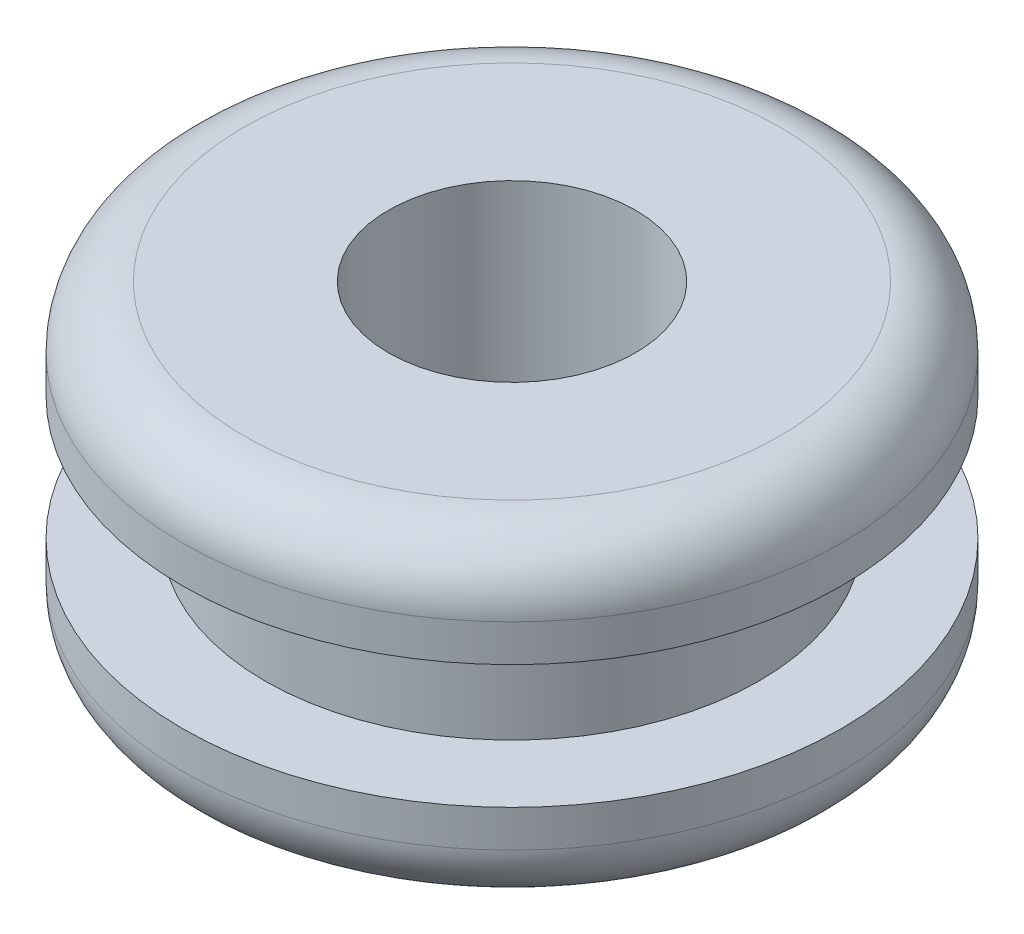
ISO-10303-21;
HEADER;
FILE_DESCRIPTION(('STEP AP214'),'2;1');
FILE_NAME('part.step','',(''),(''),'','','');
FILE_SCHEMA(('AUTOMOTIVE_DESIGN { 1 0 10303 214 1 1 1 1 }'));
ENDSEC;
DATA;
#1=APPLICATION_CONTEXT('core data for automotive mechanical design processes');
#2=APPLICATION_PROTOCOL_DEFINITION('international standard','automotive_design',2000,#1);
#3=PRODUCT_CONTEXT('',#1,'mechanical');
#4=PRODUCT('Part','Part','',(#3));
#5=PRODUCT_RELATED_PRODUCT_CATEGORY('part','',(#4));
#6=PRODUCT_DEFINITION_FORMATION('','',#4);
#7=PRODUCT_DEFINITION_CONTEXT('part definition',#1,'design');
#8=PRODUCT_DEFINITION('design','',#6,#7);
#9=PRODUCT_DEFINITION_SHAPE('','',#8);
#10=(LENGTH_UNIT() NAMED_UNIT(*) SI_UNIT(.MILLI.,.METRE.));
#11=(NAMED_UNIT(*) PLANE_ANGLE_UNIT() SI_UNIT($,.RADIAN.));
#12=(NAMED_UNIT(*) SI_UNIT($,.STERADIAN.) SOLID_ANGLE_UNIT());
#13=UNCERTAINTY_MEASURE_WITH_UNIT(LENGTH_MEASURE(1.E-05),#10,'distance_accuracy_value','');
#14=(GEOMETRIC_REPRESENTATION_CONTEXT(3) GLOBAL_UNCERTAINTY_ASSIGNED_CONTEXT((#13)) GLOBAL_UNIT_ASSIGNED_CONTEXT((#10,
#11,#12)) REPRESENTATION_CONTEXT('',''));
#15=CARTESIAN_POINT('',(0.,0.,0.));
#16=DIRECTION('',(0.,0.,1.));
#17=DIRECTION('',(1.,0.,0.));
#18=AXIS2_PLACEMENT_3D('',#15,#16,#17);
#19=CARTESIAN_POINT('',(0.,1.95,1.5));
#20=DIRECTION('',(0.,-1.,0.));
#21=DIRECTION('',(0.,0.,-1.));
#22=AXIS2_PLACEMENT_3D('',#19,#20,#21);
#23=PLANE('',#22);
#24=CARTESIAN_POINT('',(0.,1.95,0.));
#25=DIRECTION('',(0.,-1.,0.));
#26=DIRECTION('',(0.,0.,-1.));
#27=AXIS2_PLACEMENT_3D('',#24,#25,#26);
#28=CIRCLE('',#27,3.25);
#29=CARTESIAN_POINT('',(0.,1.95,-3.25));
#30=VERTEX_POINT('',#29);
#31=EDGE_CURVE('E80',#30,#30,#28,.T.);
#32=ORIENTED_EDGE('',*,*,#31,.F.);
#33=EDGE_LOOP('',(#32));
#34=FACE_BOUND('',#33,.T.);
#35=CARTESIAN_POINT('',(0.,1.95,0.));
#36=DIRECTION('',(0.,-1.,0.));
#37=DIRECTION('',(0.,0.,-1.));
#38=AXIS2_PLACEMENT_3D('',#35,#36,#37);
#39=CIRCLE('',#38,1.5);
#40=CARTESIAN_POINT('',(0.,1.95,-1.5));
#41=VERTEX_POINT('',#40);
#42=EDGE_CURVE('E10',#41,#41,#39,.T.);
#43=ORIENTED_EDGE('',*,*,#42,.T.);
#44=EDGE_LOOP('',(#43));
#45=FACE_BOUND('',#44,.T.);
#46=ADVANCED_FACE('F37',(#34,#45),#23,.F.);
#47=CARTESIAN_POINT('',(0.,0.,0.));
#48=DIRECTION('',(0.,-1.,0.));
#49=DIRECTION('',(0.,0.,-1.));
#50=AXIS2_PLACEMENT_3D('',#47,#48,#49);
#51=CYLINDRICAL_SURFACE('',#50,1.5);
#52=ORIENTED_EDGE('',*,*,#42,.F.);
#53=EDGE_LOOP('',(#52));
#54=FACE_BOUND('',#53,.T.);
#55=CARTESIAN_POINT('',(0.,-1.95,0.));
#56=DIRECTION('',(0.,-1.,0.));
#57=DIRECTION('',(0.,0.,-1.));
#58=AXIS2_PLACEMENT_3D('',#55,#56,#57);
#59=CIRCLE('',#58,1.5);
#60=CARTESIAN_POINT('',(0.,-1.95,-1.5));
#61=VERTEX_POINT('',#60);
#62=EDGE_CURVE('E44',#61,#61,#59,.T.);
#63=ORIENTED_EDGE('',*,*,#62,.T.);
#64=EDGE_LOOP('',(#63));
#65=FACE_BOUND('',#64,.T.);
#66=ADVANCED_FACE('F88',(#54,#65),#51,.F.);
#67=CARTESIAN_POINT('',(0.,-1.95,1.5));
#68=DIRECTION('',(0.,1.,0.));
#69=DIRECTION('',(0.,0.,1.));
#70=AXIS2_PLACEMENT_3D('',#67,#68,#69);
#71=PLANE('',#70);
#72=ORIENTED_EDGE('',*,*,#62,.F.);
#73=EDGE_LOOP('',(#72));
#74=FACE_BOUND('',#73,.T.);
#75=CARTESIAN_POINT('',(0.,-1.95,0.));
#76=DIRECTION('',(0.,-1.,0.));
#77=DIRECTION('',(0.,0.,-1.));
#78=AXIS2_PLACEMENT_3D('',#75,#76,#77);
#79=CIRCLE('',#78,3.25);
#80=CARTESIAN_POINT('',(0.,-1.95,-3.25));
#81=VERTEX_POINT('',#80);
#82=EDGE_CURVE('E49',#81,#81,#79,.T.);
#83=ORIENTED_EDGE('',*,*,#82,.T.);
#84=EDGE_LOOP('',(#83));
#85=FACE_BOUND('',#84,.T.);
#86=ADVANCED_FACE('F92',(#74,#85),#71,.F.);
#87=CARTESIAN_POINT('',(0.,-1.2,0.));
#88=DIRECTION('',(0.,-1.,0.));
#89=DIRECTION('',(0.,0.,-1.));
#90=AXIS2_PLACEMENT_3D('',#87,#88,#89);
#91=TOROIDAL_SURFACE('',#90,3.25,0.749999999999999);
#92=ORIENTED_EDGE('',*,*,#82,.F.);
#93=EDGE_LOOP('',(#92));
#94=FACE_BOUND('',#93,.T.);
#95=CARTESIAN_POINT('',(0.,-1.2,0.));
#96=DIRECTION('',(0.,-1.,0.));
#97=DIRECTION('',(0.,0.,-1.));
#98=AXIS2_PLACEMENT_3D('',#95,#96,#97);
#99=CIRCLE('',#98,4.);
#100=CARTESIAN_POINT('',(0.,-1.2,-4.));
#101=VERTEX_POINT('',#100);
#102=EDGE_CURVE('E54',#101,#101,#99,.T.);
#103=ORIENTED_EDGE('',*,*,#102,.T.);
#104=EDGE_LOOP('',(#103));
#105=FACE_BOUND('',#104,.T.);
#106=ADVANCED_FACE('F97',(#94,#105),#91,.T.);
#107=CARTESIAN_POINT('',(0.,0.,0.));
#108=DIRECTION('',(0.,-1.,0.));
#109=DIRECTION('',(0.,0.,-1.));
#110=AXIS2_PLACEMENT_3D('',#107,#108,#109);
#111=CYLINDRICAL_SURFACE('',#110,4.);
#112=ORIENTED_EDGE('',*,*,#102,.F.);
#113=EDGE_LOOP('',(#112));
#114=FACE_BOUND('',#113,.T.);
#115=CARTESIAN_POINT('',(0.,-0.749999999999999,0.));
#116=DIRECTION('',(0.,-1.,0.));
#117=DIRECTION('',(0.,0.,-1.));
#118=AXIS2_PLACEMENT_3D('',#115,#116,#117);
#119=CIRCLE('',#118,4.);
#120=CARTESIAN_POINT('',(0.,-0.749999999999999,-4.));
#121=VERTEX_POINT('',#120);
#122=EDGE_CURVE('E60',#121,#121,#119,.T.);
#123=ORIENTED_EDGE('',*,*,#122,.T.);
#124=EDGE_LOOP('',(#123));
#125=FACE_BOUND('',#124,.T.);
#126=ADVANCED_FACE('F103',(#114,#125),#111,.T.);
#127=CARTESIAN_POINT('',(0.,-0.749999999999999,3.));
#128=DIRECTION('',(0.,-1.,0.));
#129=DIRECTION('',(0.,0.,-1.));
#130=AXIS2_PLACEMENT_3D('',#127,#128,#129);
#131=PLANE('',#130);
#132=ORIENTED_EDGE('',*,*,#122,.F.);
#133=EDGE_LOOP('',(#132));
#134=FACE_BOUND('',#133,.T.);
#135=CARTESIAN_POINT('',(0.,-0.75,0.));
#136=DIRECTION('',(0.,-1.,0.));
#137=DIRECTION('',(0.,0.,-1.));
#138=AXIS2_PLACEMENT_3D('',#135,#136,#137);
#139=CIRCLE('',#138,3.);
#140=CARTESIAN_POINT('',(0.,-0.75,-3.));
#141=VERTEX_POINT('',#140);
#142=EDGE_CURVE('E64',#141,#141,#139,.T.);
#143=ORIENTED_EDGE('',*,*,#142,.T.);
#144=EDGE_LOOP('',(#143));
#145=FACE_BOUND('',#144,.T.);
#146=ADVANCED_FACE('F107',(#134,#145),#131,.F.);
#147=CARTESIAN_POINT('',(0.,0.,0.));
#148=DIRECTION('',(0.,-1.,0.));
#149=DIRECTION('',(0.,0.,-1.));
#150=AXIS2_PLACEMENT_3D('',#147,#148,#149);
#151=CYLINDRICAL_SURFACE('',#150,3.);
#152=ORIENTED_EDGE('',*,*,#142,.F.);
#153=EDGE_LOOP('',(#152));
#154=FACE_BOUND('',#153,.T.);
#155=CARTESIAN_POINT('',(0.,0.75,0.));
#156=DIRECTION('',(0.,-1.,0.));
#157=DIRECTION('',(0.,0.,-1.));
#158=AXIS2_PLACEMENT_3D('',#155,#156,#157);
#159=CIRCLE('',#158,3.);
#160=CARTESIAN_POINT('',(0.,0.75,-3.));
#161=VERTEX_POINT('',#160);
#162=EDGE_CURVE('E68',#161,#161,#159,.T.);
#163=ORIENTED_EDGE('',*,*,#162,.T.);
#164=EDGE_LOOP('',(#163));
#165=FACE_BOUND('',#164,.T.);
#166=ADVANCED_FACE('F111',(#154,#165),#151,.T.);
#167=CARTESIAN_POINT('',(0.,0.749999999999999,3.));
#168=DIRECTION('',(0.,1.,0.));
#169=DIRECTION('',(0.,0.,1.));
#170=AXIS2_PLACEMENT_3D('',#167,#168,#169);
#171=PLANE('',#170);
#172=ORIENTED_EDGE('',*,*,#162,.F.);
#173=EDGE_LOOP('',(#172));
#174=FACE_BOUND('',#173,.T.);
#175=CARTESIAN_POINT('',(0.,0.749999999999999,0.));
#176=DIRECTION('',(0.,-1.,0.));
#177=DIRECTION('',(0.,0.,-1.));
#178=AXIS2_PLACEMENT_3D('',#175,#176,#177);
#179=CIRCLE('',#178,4.);
#180=CARTESIAN_POINT('',(0.,0.749999999999999,-4.));
#181=VERTEX_POINT('',#180);
#182=EDGE_CURVE('E72',#181,#181,#179,.T.);
#183=ORIENTED_EDGE('',*,*,#182,.T.);
#184=EDGE_LOOP('',(#183));
#185=FACE_BOUND('',#184,.T.);
#186=ADVANCED_FACE('F115',(#174,#185),#171,.F.);
#187=CARTESIAN_POINT('',(0.,0.,0.));
#188=DIRECTION('',(0.,-1.,0.));
#189=DIRECTION('',(0.,0.,-1.));
#190=AXIS2_PLACEMENT_3D('',#187,#188,#189);
#191=CYLINDRICAL_SURFACE('',#190,4.);
#192=ORIENTED_EDGE('',*,*,#182,.F.);
#193=EDGE_LOOP('',(#192));
#194=FACE_BOUND('',#193,.T.);
#195=CARTESIAN_POINT('',(0.,1.2,0.));
#196=DIRECTION('',(0.,-1.,0.));
#197=DIRECTION('',(0.,0.,-1.));
#198=AXIS2_PLACEMENT_3D('',#195,#196,#197);
#199=CIRCLE('',#198,4.);
#200=CARTESIAN_POINT('',(0.,1.2,-4.));
#201=VERTEX_POINT('',#200);
#202=EDGE_CURVE('E76',#201,#201,#199,.T.);
#203=ORIENTED_EDGE('',*,*,#202,.T.);
#204=EDGE_LOOP('',(#203));
#205=FACE_BOUND('',#204,.T.);
#206=ADVANCED_FACE('F119',(#194,#205),#191,.T.);
#207=CARTESIAN_POINT('',(0.,1.2,0.));
#208=DIRECTION('',(0.,-1.,0.));
#209=DIRECTION('',(0.,0.,-1.));
#210=AXIS2_PLACEMENT_3D('',#207,#208,#209);
#211=TOROIDAL_SURFACE('',#210,3.25,0.75);
#212=ORIENTED_EDGE('',*,*,#202,.F.);
#213=EDGE_LOOP('',(#212));
#214=FACE_BOUND('',#213,.T.);
#215=ORIENTED_EDGE('',*,*,#31,.T.);
#216=EDGE_LOOP('',(#215));
#217=FACE_BOUND('',#216,.T.);
#218=ADVANCED_FACE('F85',(#214,#217),#211,.T.);
#219=CLOSED_SHELL('',(#46,#66,#86,#106,#126,#146,#166,#186,#206,#218));
#220=MANIFOLD_SOLID_BREP('B2',#219);
#221=ADVANCED_BREP_SHAPE_REPRESENTATION('',(#18,#220),#14);
#222=SHAPE_DEFINITION_REPRESENTATION(#9,#221);
ENDSEC;
END-ISO-10303-21;
